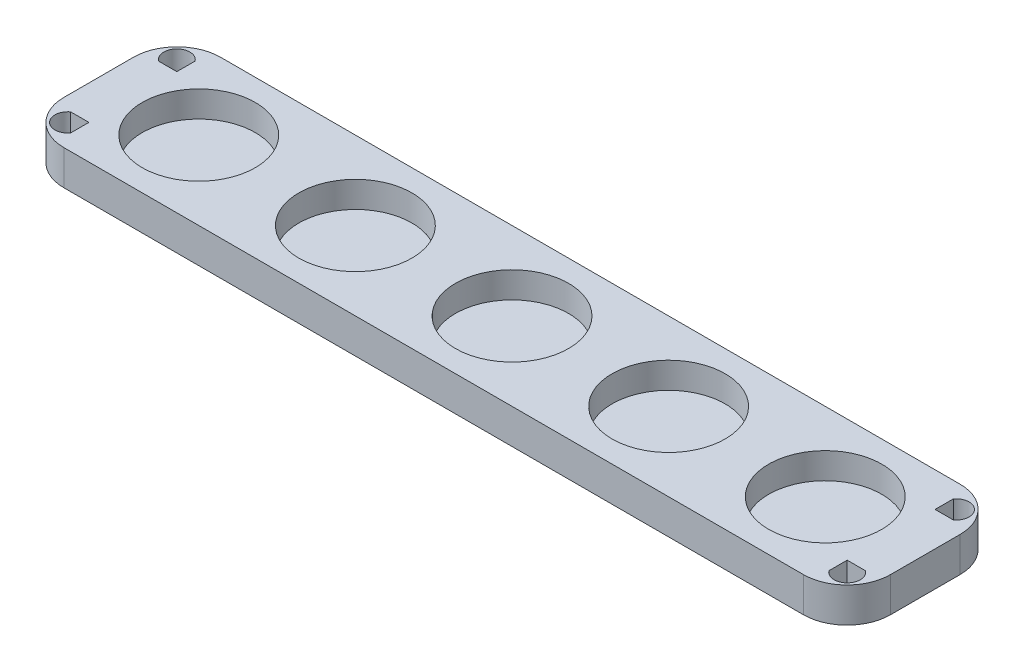
ISO-10303-21;
HEADER;
FILE_DESCRIPTION(('STEP AP214'),'2;1');
FILE_NAME('part.step','',(''),(''),'','','');
FILE_SCHEMA(('AUTOMOTIVE_DESIGN { 1 0 10303 214 1 1 1 1 }'));
ENDSEC;
DATA;
#1=APPLICATION_CONTEXT('core data for automotive mechanical design processes');
#2=APPLICATION_PROTOCOL_DEFINITION('international standard','automotive_design',2000,#1);
#3=PRODUCT_CONTEXT('',#1,'mechanical');
#4=PRODUCT('Part','Part','',(#3));
#5=PRODUCT_RELATED_PRODUCT_CATEGORY('part','',(#4));
#6=PRODUCT_DEFINITION_FORMATION('','',#4);
#7=PRODUCT_DEFINITION_CONTEXT('part definition',#1,'design');
#8=PRODUCT_DEFINITION('design','',#6,#7);
#9=PRODUCT_DEFINITION_SHAPE('','',#8);
#10=(LENGTH_UNIT() NAMED_UNIT(*) SI_UNIT(.MILLI.,.METRE.));
#11=(NAMED_UNIT(*) PLANE_ANGLE_UNIT() SI_UNIT($,.RADIAN.));
#12=(NAMED_UNIT(*) SI_UNIT($,.STERADIAN.) SOLID_ANGLE_UNIT());
#13=UNCERTAINTY_MEASURE_WITH_UNIT(LENGTH_MEASURE(1.E-05),#10,'distance_accuracy_value','');
#14=(GEOMETRIC_REPRESENTATION_CONTEXT(3) GLOBAL_UNCERTAINTY_ASSIGNED_CONTEXT((#13)) GLOBAL_UNIT_ASSIGNED_CONTEXT((#10,
#11,#12)) REPRESENTATION_CONTEXT('',''));
#15=CARTESIAN_POINT('',(0.,0.,0.));
#16=DIRECTION('',(0.,0.,1.));
#17=DIRECTION('',(1.,0.,0.));
#18=AXIS2_PLACEMENT_3D('',#15,#16,#17);
#19=CARTESIAN_POINT('',(0.,8.,0.));
#20=DIRECTION('',(0.,-1.,0.));
#21=DIRECTION('',(0.,0.,-1.));
#22=AXIS2_PLACEMENT_3D('',#19,#20,#21);
#23=PLANE('',#22);
#24=DIRECTION('',(-1.,0.,0.));
#25=VECTOR('',#24,1.);
#26=CARTESIAN_POINT('',(186.347435554875,8.,-28.100196168739));
#27=LINE('',#26,#25);
#28=CARTESIAN_POINT('',(186.347435554875,8.,-28.100196168739));
#29=VERTEX_POINT('',#28);
#30=CARTESIAN_POINT('',(182.147435554875,8.,-28.100196168739));
#31=VERTEX_POINT('',#30);
#32=EDGE_CURVE('E69',#29,#31,#27,.T.);
#33=ORIENTED_EDGE('',*,*,#32,.T.);
#34=DIRECTION('',(0.,0.,-1.));
#35=VECTOR('',#34,1.);
#36=CARTESIAN_POINT('',(182.147435554875,8.,-28.100196168739));
#37=LINE('',#36,#35);
#38=CARTESIAN_POINT('',(182.147435554875,8.,-32.300196168739));
#39=VERTEX_POINT('',#38);
#40=EDGE_CURVE('E269',#31,#39,#37,.T.);
#41=ORIENTED_EDGE('',*,*,#40,.T.);
#42=CARTESIAN_POINT('',(184.553451982046,8.,-30.5062125959102));
#43=DIRECTION('',(0.,-1.,0.));
#44=DIRECTION('',(0.,0.,-1.));
#45=AXIS2_PLACEMENT_3D('',#42,#43,#44);
#46=CIRCLE('',#45,3.00121510515279);
#47=EDGE_CURVE('E265',#39,#29,#46,.T.);
#48=ORIENTED_EDGE('',*,*,#47,.T.);
#49=EDGE_LOOP('',(#33,#41,#48));
#50=FACE_BOUND('',#49,.T.);
#51=CARTESIAN_POINT('',(184.553451982046,8.,-5.4937874040897));
#52=DIRECTION('',(0.,1.,0.));
#53=DIRECTION('',(0.,0.,1.));
#54=AXIS2_PLACEMENT_3D('',#51,#52,#53);
#55=CIRCLE('',#54,3.00121510515279);
#56=CARTESIAN_POINT('',(182.147435554875,8.,-3.69980383126088));
#57=VERTEX_POINT('',#56);
#58=CARTESIAN_POINT('',(186.347435554875,8.,-7.89980383126088));
#59=VERTEX_POINT('',#58);
#60=EDGE_CURVE('E207',#57,#59,#55,.T.);
#61=ORIENTED_EDGE('',*,*,#60,.F.);
#62=DIRECTION('',(0.,0.,1.));
#63=VECTOR('',#62,1.);
#64=CARTESIAN_POINT('',(182.147435554875,8.,-7.89980383126087));
#65=LINE('',#64,#63);
#66=CARTESIAN_POINT('',(182.147435554875,8.,-7.89980383126087));
#67=VERTEX_POINT('',#66);
#68=EDGE_CURVE('E190',#67,#57,#65,.T.);
#69=ORIENTED_EDGE('',*,*,#68,.F.);
#70=DIRECTION('',(-1.,0.,0.));
#71=VECTOR('',#70,1.);
#72=CARTESIAN_POINT('',(186.347435554875,8.,-7.89980383126086));
#73=LINE('',#72,#71);
#74=EDGE_CURVE('E200',#59,#67,#73,.T.);
#75=ORIENTED_EDGE('',*,*,#74,.F.);
#76=EDGE_LOOP('',(#61,#69,#75));
#77=FACE_BOUND('',#76,.T.);
#78=CARTESIAN_POINT('',(5.44654801795418,8.,-30.5062125959102));
#79=DIRECTION('',(0.,1.,0.));
#80=DIRECTION('',(0.,0.,1.));
#81=AXIS2_PLACEMENT_3D('',#78,#79,#80);
#82=CIRCLE('',#81,3.00121510515278);
#83=CARTESIAN_POINT('',(7.85256444512534,8.,-32.3001961687391));
#84=VERTEX_POINT('',#83);
#85=CARTESIAN_POINT('',(3.65256444512534,8.,-28.1001961687391));
#86=VERTEX_POINT('',#85);
#87=EDGE_CURVE('E300',#84,#86,#82,.T.);
#88=ORIENTED_EDGE('',*,*,#87,.F.);
#89=DIRECTION('',(0.,0.,-1.));
#90=VECTOR('',#89,1.);
#91=CARTESIAN_POINT('',(7.85256444512534,8.,-28.1001961687391));
#92=LINE('',#91,#90);
#93=CARTESIAN_POINT('',(7.85256444512534,8.,-28.1001961687391));
#94=VERTEX_POINT('',#93);
#95=EDGE_CURVE('E250',#94,#84,#92,.T.);
#96=ORIENTED_EDGE('',*,*,#95,.F.);
#97=DIRECTION('',(1.,0.,0.));
#98=VECTOR('',#97,1.);
#99=CARTESIAN_POINT('',(3.65256444512534,8.,-28.1001961687391));
#100=LINE('',#99,#98);
#101=EDGE_CURVE('E289',#86,#94,#100,.T.);
#102=ORIENTED_EDGE('',*,*,#101,.F.);
#103=EDGE_LOOP('',(#88,#96,#102));
#104=FACE_BOUND('',#103,.T.);
#105=CARTESIAN_POINT('',(23.,8.,-18.));
#106=DIRECTION('',(0.,1.,0.));
#107=DIRECTION('',(0.,0.,1.));
#108=AXIS2_PLACEMENT_3D('',#105,#106,#107);
#109=CIRCLE('',#108,13.);
#110=CARTESIAN_POINT('',(23.,8.,-4.99999999999999));
#111=VERTEX_POINT('',#110);
#112=EDGE_CURVE('E322',#111,#111,#109,.T.);
#113=ORIENTED_EDGE('',*,*,#112,.F.);
#114=EDGE_LOOP('',(#113));
#115=FACE_BOUND('',#114,.T.);
#116=CARTESIAN_POINT('',(59.,8.,-18.));
#117=DIRECTION('',(0.,1.,0.));
#118=DIRECTION('',(0.,0.,1.));
#119=AXIS2_PLACEMENT_3D('',#116,#117,#118);
#120=CIRCLE('',#119,13.);
#121=CARTESIAN_POINT('',(59.,8.,-4.99999999999998));
#122=VERTEX_POINT('',#121);
#123=EDGE_CURVE('E326',#122,#122,#120,.T.);
#124=ORIENTED_EDGE('',*,*,#123,.F.);
#125=EDGE_LOOP('',(#124));
#126=FACE_BOUND('',#125,.T.);
#127=CARTESIAN_POINT('',(95.0046201605951,8.,-18.));
#128=DIRECTION('',(0.,1.,0.));
#129=DIRECTION('',(0.,0.,1.));
#130=AXIS2_PLACEMENT_3D('',#127,#128,#129);
#131=CIRCLE('',#130,13.);
#132=CARTESIAN_POINT('',(95.0046201605951,8.,-5.));
#133=VERTEX_POINT('',#132);
#134=EDGE_CURVE('E334',#133,#133,#131,.T.);
#135=ORIENTED_EDGE('',*,*,#134,.F.);
#136=EDGE_LOOP('',(#135));
#137=FACE_BOUND('',#136,.T.);
#138=CARTESIAN_POINT('',(131.004620160595,8.,-18.));
#139=DIRECTION('',(0.,1.,0.));
#140=DIRECTION('',(0.,0.,1.));
#141=AXIS2_PLACEMENT_3D('',#138,#139,#140);
#142=CIRCLE('',#141,13.);
#143=CARTESIAN_POINT('',(131.004620160595,8.,-5.00000000000002));
#144=VERTEX_POINT('',#143);
#145=EDGE_CURVE('E342',#144,#144,#142,.T.);
#146=ORIENTED_EDGE('',*,*,#145,.F.);
#147=EDGE_LOOP('',(#146));
#148=FACE_BOUND('',#147,.T.);
#149=CARTESIAN_POINT('',(167.002310080298,8.,-18.));
#150=DIRECTION('',(0.,1.,0.));
#151=DIRECTION('',(0.,0.,1.));
#152=AXIS2_PLACEMENT_3D('',#149,#150,#151);
#153=CIRCLE('',#152,12.9976899197025);
#154=CARTESIAN_POINT('',(167.002310080298,8.,-5.00231008029754));
#155=VERTEX_POINT('',#154);
#156=EDGE_CURVE('E350',#155,#155,#153,.T.);
#157=ORIENTED_EDGE('',*,*,#156,.F.);
#158=EDGE_LOOP('',(#157));
#159=FACE_BOUND('',#158,.T.);
#160=DIRECTION('',(1.,0.,0.));
#161=VECTOR('',#160,1.);
#162=CARTESIAN_POINT('',(0.,8.,0.));
#163=LINE('',#162,#161);
#164=CARTESIAN_POINT('',(10.,8.,0.));
#165=VERTEX_POINT('',#164);
#166=CARTESIAN_POINT('',(180.,8.,0.));
#167=VERTEX_POINT('',#166);
#168=EDGE_CURVE('E361',#165,#167,#163,.T.);
#169=ORIENTED_EDGE('',*,*,#168,.T.);
#170=CARTESIAN_POINT('',(180.,8.,-10.));
#171=DIRECTION('',(0.,-1.,0.));
#172=DIRECTION('',(0.,0.,-1.));
#173=AXIS2_PLACEMENT_3D('',#170,#171,#172);
#174=CIRCLE('',#173,10.);
#175=CARTESIAN_POINT('',(190.,8.,-10.));
#176=VERTEX_POINT('',#175);
#177=EDGE_CURVE('E423',#167,#176,#174,.F.);
#178=ORIENTED_EDGE('',*,*,#177,.T.);
#179=DIRECTION('',(0.,0.,-1.));
#180=VECTOR('',#179,1.);
#181=CARTESIAN_POINT('',(190.,8.,0.));
#182=LINE('',#181,#180);
#183=CARTESIAN_POINT('',(190.,8.,-26.));
#184=VERTEX_POINT('',#183);
#185=EDGE_CURVE('E366',#176,#184,#182,.T.);
#186=ORIENTED_EDGE('',*,*,#185,.T.);
#187=CARTESIAN_POINT('',(180.,8.,-26.));
#188=DIRECTION('',(0.,-1.,0.));
#189=DIRECTION('',(0.,0.,-1.));
#190=AXIS2_PLACEMENT_3D('',#187,#188,#189);
#191=CIRCLE('',#190,10.);
#192=CARTESIAN_POINT('',(180.,8.,-36.));
#193=VERTEX_POINT('',#192);
#194=EDGE_CURVE('E420',#184,#193,#191,.F.);
#195=ORIENTED_EDGE('',*,*,#194,.T.);
#196=DIRECTION('',(-1.,0.,0.));
#197=VECTOR('',#196,1.);
#198=CARTESIAN_POINT('',(0.,8.,-36.));
#199=LINE('',#198,#197);
#200=CARTESIAN_POINT('',(10.,8.,-36.));
#201=VERTEX_POINT('',#200);
#202=EDGE_CURVE('E370',#193,#201,#199,.T.);
#203=ORIENTED_EDGE('',*,*,#202,.T.);
#204=CARTESIAN_POINT('',(10.,8.,-26.));
#205=DIRECTION('',(0.,-1.,0.));
#206=DIRECTION('',(0.,0.,-1.));
#207=AXIS2_PLACEMENT_3D('',#204,#205,#206);
#208=CIRCLE('',#207,10.);
#209=CARTESIAN_POINT('',(0.,8.,-26.));
#210=VERTEX_POINT('',#209);
#211=EDGE_CURVE('E417',#201,#210,#208,.F.);
#212=ORIENTED_EDGE('',*,*,#211,.T.);
#213=DIRECTION('',(0.,0.,1.));
#214=VECTOR('',#213,1.);
#215=CARTESIAN_POINT('',(0.,8.,0.));
#216=LINE('',#215,#214);
#217=CARTESIAN_POINT('',(0.,8.,-10.));
#218=VERTEX_POINT('',#217);
#219=EDGE_CURVE('E357',#210,#218,#216,.T.);
#220=ORIENTED_EDGE('',*,*,#219,.T.);
#221=CARTESIAN_POINT('',(10.,8.,-10.));
#222=DIRECTION('',(0.,-1.,0.));
#223=DIRECTION('',(0.,0.,-1.));
#224=AXIS2_PLACEMENT_3D('',#221,#222,#223);
#225=CIRCLE('',#224,10.);
#226=EDGE_CURVE('E414',#218,#165,#225,.F.);
#227=ORIENTED_EDGE('',*,*,#226,.T.);
#228=EDGE_LOOP('',(#169,#178,#186,#195,#203,#212,#220,#227));
#229=FACE_BOUND('',#228,.T.);
#230=CARTESIAN_POINT('',(5.44654801795418,8.,-5.49378740408977));
#231=DIRECTION('',(0.,-1.,0.));
#232=DIRECTION('',(0.,0.,-1.));
#233=AXIS2_PLACEMENT_3D('',#230,#231,#232);
#234=CIRCLE('',#233,3.00121510515278);
#235=CARTESIAN_POINT('',(7.85256444512534,8.,-3.69980383126093));
#236=VERTEX_POINT('',#235);
#237=CARTESIAN_POINT('',(3.65256444512534,8.,-7.89980383126093));
#238=VERTEX_POINT('',#237);
#239=EDGE_CURVE('E61',#236,#238,#234,.T.);
#240=ORIENTED_EDGE('',*,*,#239,.T.);
#241=DIRECTION('',(1.,0.,0.));
#242=VECTOR('',#241,1.);
#243=CARTESIAN_POINT('',(3.65256444512534,8.,-7.89980383126093));
#244=LINE('',#243,#242);
#245=CARTESIAN_POINT('',(7.85256444512534,8.,-7.89980383126094));
#246=VERTEX_POINT('',#245);
#247=EDGE_CURVE('E243',#238,#246,#244,.T.);
#248=ORIENTED_EDGE('',*,*,#247,.T.);
#249=DIRECTION('',(0.,0.,1.));
#250=VECTOR('',#249,1.);
#251=CARTESIAN_POINT('',(7.85256444512534,8.,-7.89980383126094));
#252=LINE('',#251,#250);
#253=EDGE_CURVE('E239',#246,#236,#252,.T.);
#254=ORIENTED_EDGE('',*,*,#253,.T.);
#255=EDGE_LOOP('',(#240,#248,#254));
#256=FACE_BOUND('',#255,.T.);
#257=ADVANCED_FACE('F45',(#50,#77,#104,#115,#126,#137,#148,#159,#229,#256),#23,.F.);
#258=CARTESIAN_POINT('',(0.,0.,0.));
#259=DIRECTION('',(0.,-1.,0.));
#260=DIRECTION('',(0.,0.,-1.));
#261=AXIS2_PLACEMENT_3D('',#258,#259,#260);
#262=PLANE('',#261);
#263=DIRECTION('',(0.,0.,1.));
#264=VECTOR('',#263,1.);
#265=CARTESIAN_POINT('',(182.147435554875,0.,-7.89980383126087));
#266=LINE('',#265,#264);
#267=CARTESIAN_POINT('',(182.147435554875,0.,-7.89980383126087));
#268=VERTEX_POINT('',#267);
#269=CARTESIAN_POINT('',(182.147435554875,0.,-3.69980383126087));
#270=VERTEX_POINT('',#269);
#271=EDGE_CURVE('E193',#268,#270,#266,.T.);
#272=ORIENTED_EDGE('',*,*,#271,.T.);
#273=CARTESIAN_POINT('',(184.553451982046,0.,-5.4937874040897));
#274=DIRECTION('',(0.,1.,0.));
#275=DIRECTION('',(0.,0.,1.));
#276=AXIS2_PLACEMENT_3D('',#273,#274,#275);
#277=CIRCLE('',#276,3.00121510515279);
#278=CARTESIAN_POINT('',(186.347435554875,0.,-7.89980383126088));
#279=VERTEX_POINT('',#278);
#280=EDGE_CURVE('E222',#270,#279,#277,.T.);
#281=ORIENTED_EDGE('',*,*,#280,.T.);
#282=DIRECTION('',(-1.,0.,0.));
#283=VECTOR('',#282,1.);
#284=CARTESIAN_POINT('',(186.347435554875,0.,-7.89980383126086));
#285=LINE('',#284,#283);
#286=EDGE_CURVE('E219',#279,#268,#285,.T.);
#287=ORIENTED_EDGE('',*,*,#286,.T.);
#288=EDGE_LOOP('',(#272,#281,#287));
#289=FACE_BOUND('',#288,.T.);
#290=DIRECTION('',(0.,0.,-1.));
#291=VECTOR('',#290,1.);
#292=CARTESIAN_POINT('',(7.85256444512534,0.,-28.1001961687391));
#293=LINE('',#292,#291);
#294=CARTESIAN_POINT('',(7.85256444512534,0.,-28.1001961687391));
#295=VERTEX_POINT('',#294);
#296=CARTESIAN_POINT('',(7.85256444512534,0.,-32.3001961687391));
#297=VERTEX_POINT('',#296);
#298=EDGE_CURVE('E284',#295,#297,#293,.T.);
#299=ORIENTED_EDGE('',*,*,#298,.T.);
#300=CARTESIAN_POINT('',(5.44654801795418,0.,-30.5062125959102));
#301=DIRECTION('',(0.,1.,0.));
#302=DIRECTION('',(0.,0.,1.));
#303=AXIS2_PLACEMENT_3D('',#300,#301,#302);
#304=CIRCLE('',#303,3.00121510515278);
#305=CARTESIAN_POINT('',(3.65256444512534,0.,-28.1001961687391));
#306=VERTEX_POINT('',#305);
#307=EDGE_CURVE('E288',#297,#306,#304,.T.);
#308=ORIENTED_EDGE('',*,*,#307,.T.);
#309=DIRECTION('',(1.,0.,0.));
#310=VECTOR('',#309,1.);
#311=CARTESIAN_POINT('',(3.65256444512534,0.,-28.1001961687391));
#312=LINE('',#311,#310);
#313=EDGE_CURVE('E293',#306,#295,#312,.T.);
#314=ORIENTED_EDGE('',*,*,#313,.T.);
#315=EDGE_LOOP('',(#299,#308,#314));
#316=FACE_BOUND('',#315,.T.);
#317=DIRECTION('',(0.,0.,-1.));
#318=VECTOR('',#317,1.);
#319=CARTESIAN_POINT('',(190.,0.,0.));
#320=LINE('',#319,#318);
#321=CARTESIAN_POINT('',(190.,0.,-10.));
#322=VERTEX_POINT('',#321);
#323=CARTESIAN_POINT('',(190.,0.,-26.));
#324=VERTEX_POINT('',#323);
#325=EDGE_CURVE('E382',#322,#324,#320,.T.);
#326=ORIENTED_EDGE('',*,*,#325,.F.);
#327=CARTESIAN_POINT('',(180.,0.,-10.));
#328=DIRECTION('',(0.,-1.,0.));
#329=DIRECTION('',(0.,0.,-1.));
#330=AXIS2_PLACEMENT_3D('',#327,#328,#329);
#331=CIRCLE('',#330,10.);
#332=CARTESIAN_POINT('',(180.,0.,0.));
#333=VERTEX_POINT('',#332);
#334=EDGE_CURVE('E404',#322,#333,#331,.T.);
#335=ORIENTED_EDGE('',*,*,#334,.T.);
#336=DIRECTION('',(1.,0.,0.));
#337=VECTOR('',#336,1.);
#338=CARTESIAN_POINT('',(0.,0.,0.));
#339=LINE('',#338,#337);
#340=CARTESIAN_POINT('',(10.,0.,0.));
#341=VERTEX_POINT('',#340);
#342=EDGE_CURVE('E378',#341,#333,#339,.T.);
#343=ORIENTED_EDGE('',*,*,#342,.F.);
#344=CARTESIAN_POINT('',(10.,0.,-10.));
#345=DIRECTION('',(0.,-1.,0.));
#346=DIRECTION('',(0.,0.,-1.));
#347=AXIS2_PLACEMENT_3D('',#344,#345,#346);
#348=CIRCLE('',#347,10.);
#349=CARTESIAN_POINT('',(0.,0.,-10.));
#350=VERTEX_POINT('',#349);
#351=EDGE_CURVE('E395',#341,#350,#348,.T.);
#352=ORIENTED_EDGE('',*,*,#351,.T.);
#353=DIRECTION('',(0.,0.,1.));
#354=VECTOR('',#353,1.);
#355=CARTESIAN_POINT('',(0.,0.,0.));
#356=LINE('',#355,#354);
#357=CARTESIAN_POINT('',(0.,0.,-26.));
#358=VERTEX_POINT('',#357);
#359=EDGE_CURVE('E321',#358,#350,#356,.T.);
#360=ORIENTED_EDGE('',*,*,#359,.F.);
#361=CARTESIAN_POINT('',(10.,0.,-26.));
#362=DIRECTION('',(0.,-1.,0.));
#363=DIRECTION('',(0.,0.,-1.));
#364=AXIS2_PLACEMENT_3D('',#361,#362,#363);
#365=CIRCLE('',#364,10.);
#366=CARTESIAN_POINT('',(10.,0.,-36.));
#367=VERTEX_POINT('',#366);
#368=EDGE_CURVE('E398',#358,#367,#365,.T.);
#369=ORIENTED_EDGE('',*,*,#368,.T.);
#370=DIRECTION('',(-1.,0.,0.));
#371=VECTOR('',#370,1.);
#372=CARTESIAN_POINT('',(0.,0.,-36.));
#373=LINE('',#372,#371);
#374=CARTESIAN_POINT('',(180.,0.,-36.));
#375=VERTEX_POINT('',#374);
#376=EDGE_CURVE('E362',#375,#367,#373,.T.);
#377=ORIENTED_EDGE('',*,*,#376,.F.);
#378=CARTESIAN_POINT('',(180.,0.,-26.));
#379=DIRECTION('',(0.,-1.,0.));
#380=DIRECTION('',(0.,0.,-1.));
#381=AXIS2_PLACEMENT_3D('',#378,#379,#380);
#382=CIRCLE('',#381,10.);
#383=EDGE_CURVE('E401',#375,#324,#382,.T.);
#384=ORIENTED_EDGE('',*,*,#383,.T.);
#385=EDGE_LOOP('',(#326,#335,#343,#352,#360,#369,#377,#384));
#386=FACE_BOUND('',#385,.T.);
#387=DIRECTION('',(0.,0.,-1.));
#388=VECTOR('',#387,1.);
#389=CARTESIAN_POINT('',(182.147435554875,0.,-28.100196168739));
#390=LINE('',#389,#388);
#391=CARTESIAN_POINT('',(182.147435554875,0.,-28.100196168739));
#392=VERTEX_POINT('',#391);
#393=CARTESIAN_POINT('',(182.147435554875,0.,-32.300196168739));
#394=VERTEX_POINT('',#393);
#395=EDGE_CURVE('E278',#392,#394,#390,.T.);
#396=ORIENTED_EDGE('',*,*,#395,.F.);
#397=DIRECTION('',(-1.,0.,0.));
#398=VECTOR('',#397,1.);
#399=CARTESIAN_POINT('',(186.347435554875,0.,-28.100196168739));
#400=LINE('',#399,#398);
#401=CARTESIAN_POINT('',(186.347435554875,0.,-28.100196168739));
#402=VERTEX_POINT('',#401);
#403=EDGE_CURVE('E270',#402,#392,#400,.T.);
#404=ORIENTED_EDGE('',*,*,#403,.F.);
#405=CARTESIAN_POINT('',(184.553451982046,0.,-30.5062125959102));
#406=DIRECTION('',(0.,-1.,0.));
#407=DIRECTION('',(0.,0.,-1.));
#408=AXIS2_PLACEMENT_3D('',#405,#406,#407);
#409=CIRCLE('',#408,3.00121510515279);
#410=EDGE_CURVE('E264',#394,#402,#409,.T.);
#411=ORIENTED_EDGE('',*,*,#410,.F.);
#412=EDGE_LOOP('',(#396,#404,#411));
#413=FACE_BOUND('',#412,.T.);
#414=DIRECTION('',(1.,0.,0.));
#415=VECTOR('',#414,1.);
#416=CARTESIAN_POINT('',(3.65256444512534,0.,-7.89980383126093));
#417=LINE('',#416,#415);
#418=CARTESIAN_POINT('',(3.65256444512534,0.,-7.89980383126093));
#419=VERTEX_POINT('',#418);
#420=CARTESIAN_POINT('',(7.85256444512534,0.,-7.89980383126094));
#421=VERTEX_POINT('',#420);
#422=EDGE_CURVE('E253',#419,#421,#417,.T.);
#423=ORIENTED_EDGE('',*,*,#422,.F.);
#424=CARTESIAN_POINT('',(5.44654801795418,0.,-5.49378740408977));
#425=DIRECTION('',(0.,-1.,0.));
#426=DIRECTION('',(0.,0.,-1.));
#427=AXIS2_PLACEMENT_3D('',#424,#425,#426);
#428=CIRCLE('',#427,3.00121510515278);
#429=CARTESIAN_POINT('',(7.85256444512534,0.,-3.69980383126093));
#430=VERTEX_POINT('',#429);
#431=EDGE_CURVE('E244',#430,#419,#428,.T.);
#432=ORIENTED_EDGE('',*,*,#431,.F.);
#433=DIRECTION('',(0.,0.,1.));
#434=VECTOR('',#433,1.);
#435=CARTESIAN_POINT('',(7.85256444512534,0.,-7.89980383126094));
#436=LINE('',#435,#434);
#437=EDGE_CURVE('E238',#421,#430,#436,.T.);
#438=ORIENTED_EDGE('',*,*,#437,.F.);
#439=EDGE_LOOP('',(#423,#432,#438));
#440=FACE_BOUND('',#439,.T.);
#441=ADVANCED_FACE('F452',(#289,#316,#386,#413,#440),#262,.T.);
#442=CARTESIAN_POINT('',(0.,8.,0.));
#443=DIRECTION('',(1.,0.,0.));
#444=DIRECTION('',(0.,0.,-1.));
#445=AXIS2_PLACEMENT_3D('',#442,#443,#444);
#446=PLANE('',#445);
#447=ORIENTED_EDGE('',*,*,#219,.F.);
#448=DIRECTION('',(0.,-1.,0.));
#449=VECTOR('',#448,1.);
#450=CARTESIAN_POINT('',(0.,8.,-26.));
#451=LINE('',#450,#449);
#452=EDGE_CURVE('E11',#210,#358,#451,.T.);
#453=ORIENTED_EDGE('',*,*,#452,.T.);
#454=ORIENTED_EDGE('',*,*,#359,.T.);
#455=DIRECTION('',(0.,-1.,0.));
#456=VECTOR('',#455,1.);
#457=CARTESIAN_POINT('',(0.,8.,-10.));
#458=LINE('',#457,#456);
#459=EDGE_CURVE('E54',#350,#218,#458,.F.);
#460=ORIENTED_EDGE('',*,*,#459,.T.);
#461=EDGE_LOOP('',(#447,#453,#454,#460));
#462=FACE_BOUND('',#461,.T.);
#463=ADVANCED_FACE('F436',(#462),#446,.F.);
#464=CARTESIAN_POINT('',(0.,8.,0.));
#465=DIRECTION('',(0.,0.,-1.));
#466=DIRECTION('',(-1.,0.,0.));
#467=AXIS2_PLACEMENT_3D('',#464,#465,#466);
#468=PLANE('',#467);
#469=ORIENTED_EDGE('',*,*,#342,.T.);
#470=DIRECTION('',(0.,-1.,0.));
#471=VECTOR('',#470,1.);
#472=CARTESIAN_POINT('',(180.,8.,0.));
#473=LINE('',#472,#471);
#474=EDGE_CURVE('E411',#333,#167,#473,.F.);
#475=ORIENTED_EDGE('',*,*,#474,.T.);
#476=ORIENTED_EDGE('',*,*,#168,.F.);
#477=DIRECTION('',(0.,-1.,0.));
#478=VECTOR('',#477,1.);
#479=CARTESIAN_POINT('',(10.,8.,0.));
#480=LINE('',#479,#478);
#481=EDGE_CURVE('E407',#165,#341,#480,.T.);
#482=ORIENTED_EDGE('',*,*,#481,.T.);
#483=EDGE_LOOP('',(#469,#475,#476,#482));
#484=FACE_BOUND('',#483,.T.);
#485=ADVANCED_FACE('F448',(#484),#468,.F.);
#486=CARTESIAN_POINT('',(190.,8.,0.));
#487=DIRECTION('',(-1.,0.,0.));
#488=DIRECTION('',(0.,0.,1.));
#489=AXIS2_PLACEMENT_3D('',#486,#487,#488);
#490=PLANE('',#489);
#491=ORIENTED_EDGE('',*,*,#185,.F.);
#492=DIRECTION('',(0.,-1.,0.));
#493=VECTOR('',#492,1.);
#494=CARTESIAN_POINT('',(190.,8.,-10.));
#495=LINE('',#494,#493);
#496=EDGE_CURVE('E391',#176,#322,#495,.T.);
#497=ORIENTED_EDGE('',*,*,#496,.T.);
#498=ORIENTED_EDGE('',*,*,#325,.T.);
#499=DIRECTION('',(0.,-1.,0.));
#500=VECTOR('',#499,1.);
#501=CARTESIAN_POINT('',(190.,8.,-26.));
#502=LINE('',#501,#500);
#503=EDGE_CURVE('E374',#324,#184,#502,.F.);
#504=ORIENTED_EDGE('',*,*,#503,.T.);
#505=EDGE_LOOP('',(#491,#497,#498,#504));
#506=FACE_BOUND('',#505,.T.);
#507=ADVANCED_FACE('F460',(#506),#490,.F.);
#508=CARTESIAN_POINT('',(0.,8.,-36.));
#509=DIRECTION('',(0.,0.,1.));
#510=DIRECTION('',(1.,0.,0.));
#511=AXIS2_PLACEMENT_3D('',#508,#509,#510);
#512=PLANE('',#511);
#513=ORIENTED_EDGE('',*,*,#202,.F.);
#514=DIRECTION('',(0.,-1.,0.));
#515=VECTOR('',#514,1.);
#516=CARTESIAN_POINT('',(180.,8.,-36.));
#517=LINE('',#516,#515);
#518=EDGE_CURVE('E429',#193,#375,#517,.T.);
#519=ORIENTED_EDGE('',*,*,#518,.T.);
#520=ORIENTED_EDGE('',*,*,#376,.T.);
#521=DIRECTION('',(0.,-1.,0.));
#522=VECTOR('',#521,1.);
#523=CARTESIAN_POINT('',(10.,8.,-36.));
#524=LINE('',#523,#522);
#525=EDGE_CURVE('E426',#367,#201,#524,.F.);
#526=ORIENTED_EDGE('',*,*,#525,.T.);
#527=EDGE_LOOP('',(#513,#519,#520,#526));
#528=FACE_BOUND('',#527,.T.);
#529=ADVANCED_FACE('F469',(#528),#512,.F.);
#530=CARTESIAN_POINT('',(167.002310080298,2.,-18.));
#531=DIRECTION('',(0.,1.,0.));
#532=DIRECTION('',(0.,0.,1.));
#533=AXIS2_PLACEMENT_3D('',#530,#531,#532);
#534=CYLINDRICAL_SURFACE('',#533,12.9976899197025);
#535=CARTESIAN_POINT('',(167.002310080298,2.,-18.));
#536=DIRECTION('',(0.,1.,0.));
#537=DIRECTION('',(0.,0.,1.));
#538=AXIS2_PLACEMENT_3D('',#535,#536,#537);
#539=CIRCLE('',#538,12.9976899197025);
#540=CARTESIAN_POINT('',(167.002310080298,2.,-5.00231008029754));
#541=VERTEX_POINT('',#540);
#542=EDGE_CURVE('E310',#541,#541,#539,.T.);
#543=ORIENTED_EDGE('',*,*,#542,.F.);
#544=EDGE_LOOP('',(#543));
#545=FACE_BOUND('',#544,.T.);
#546=ORIENTED_EDGE('',*,*,#156,.T.);
#547=EDGE_LOOP('',(#546));
#548=FACE_BOUND('',#547,.T.);
#549=ADVANCED_FACE('F494',(#545,#548),#534,.F.);
#550=CARTESIAN_POINT('',(167.002310080298,2.,-18.));
#551=DIRECTION('',(0.,1.,0.));
#552=DIRECTION('',(0.,0.,1.));
#553=AXIS2_PLACEMENT_3D('',#550,#551,#552);
#554=PLANE('',#553);
#555=ORIENTED_EDGE('',*,*,#542,.T.);
#556=EDGE_LOOP('',(#555));
#557=FACE_BOUND('',#556,.T.);
#558=ADVANCED_FACE('F489',(#557),#554,.T.);
#559=CARTESIAN_POINT('',(131.004620160595,2.,-18.));
#560=DIRECTION('',(0.,1.,0.));
#561=DIRECTION('',(0.,0.,1.));
#562=AXIS2_PLACEMENT_3D('',#559,#560,#561);
#563=CYLINDRICAL_SURFACE('',#562,13.);
#564=CARTESIAN_POINT('',(131.004620160595,2.,-18.));
#565=DIRECTION('',(0.,1.,0.));
#566=DIRECTION('',(0.,0.,1.));
#567=AXIS2_PLACEMENT_3D('',#564,#565,#566);
#568=CIRCLE('',#567,13.);
#569=CARTESIAN_POINT('',(131.004620160595,2.,-5.00000000000002));
#570=VERTEX_POINT('',#569);
#571=EDGE_CURVE('E346',#570,#570,#568,.T.);
#572=ORIENTED_EDGE('',*,*,#571,.F.);
#573=EDGE_LOOP('',(#572));
#574=FACE_BOUND('',#573,.T.);
#575=ORIENTED_EDGE('',*,*,#145,.T.);
#576=EDGE_LOOP('',(#575));
#577=FACE_BOUND('',#576,.T.);
#578=ADVANCED_FACE('F534',(#574,#577),#563,.F.);
#579=CARTESIAN_POINT('',(131.004620160595,2.,-18.));
#580=DIRECTION('',(0.,1.,0.));
#581=DIRECTION('',(0.,0.,1.));
#582=AXIS2_PLACEMENT_3D('',#579,#580,#581);
#583=PLANE('',#582);
#584=ORIENTED_EDGE('',*,*,#571,.T.);
#585=EDGE_LOOP('',(#584));
#586=FACE_BOUND('',#585,.T.);
#587=ADVANCED_FACE('F529',(#586),#583,.T.);
#588=CARTESIAN_POINT('',(95.0046201605951,2.,-18.));
#589=DIRECTION('',(0.,1.,0.));
#590=DIRECTION('',(0.,0.,1.));
#591=AXIS2_PLACEMENT_3D('',#588,#589,#590);
#592=CYLINDRICAL_SURFACE('',#591,13.);
#593=CARTESIAN_POINT('',(95.0046201605951,2.,-18.));
#594=DIRECTION('',(0.,1.,0.));
#595=DIRECTION('',(0.,0.,1.));
#596=AXIS2_PLACEMENT_3D('',#593,#594,#595);
#597=CIRCLE('',#596,13.);
#598=CARTESIAN_POINT('',(95.0046201605951,2.,-5.));
#599=VERTEX_POINT('',#598);
#600=EDGE_CURVE('E338',#599,#599,#597,.T.);
#601=ORIENTED_EDGE('',*,*,#600,.F.);
#602=EDGE_LOOP('',(#601));
#603=FACE_BOUND('',#602,.T.);
#604=ORIENTED_EDGE('',*,*,#134,.T.);
#605=EDGE_LOOP('',(#604));
#606=FACE_BOUND('',#605,.T.);
#607=ADVANCED_FACE('F526',(#603,#606),#592,.F.);
#608=CARTESIAN_POINT('',(95.0046201605951,2.,-18.));
#609=DIRECTION('',(0.,1.,0.));
#610=DIRECTION('',(0.,0.,1.));
#611=AXIS2_PLACEMENT_3D('',#608,#609,#610);
#612=PLANE('',#611);
#613=ORIENTED_EDGE('',*,*,#600,.T.);
#614=EDGE_LOOP('',(#613));
#615=FACE_BOUND('',#614,.T.);
#616=ADVANCED_FACE('F521',(#615),#612,.T.);
#617=CARTESIAN_POINT('',(59.,2.,-18.));
#618=DIRECTION('',(0.,1.,0.));
#619=DIRECTION('',(0.,0.,1.));
#620=AXIS2_PLACEMENT_3D('',#617,#618,#619);
#621=CYLINDRICAL_SURFACE('',#620,13.);
#622=CARTESIAN_POINT('',(59.,2.,-18.));
#623=DIRECTION('',(0.,1.,0.));
#624=DIRECTION('',(0.,0.,1.));
#625=AXIS2_PLACEMENT_3D('',#622,#623,#624);
#626=CIRCLE('',#625,13.);
#627=CARTESIAN_POINT('',(59.,2.,-4.99999999999998));
#628=VERTEX_POINT('',#627);
#629=EDGE_CURVE('E330',#628,#628,#626,.T.);
#630=ORIENTED_EDGE('',*,*,#629,.F.);
#631=EDGE_LOOP('',(#630));
#632=FACE_BOUND('',#631,.T.);
#633=ORIENTED_EDGE('',*,*,#123,.T.);
#634=EDGE_LOOP('',(#633));
#635=FACE_BOUND('',#634,.T.);
#636=ADVANCED_FACE('F518',(#632,#635),#621,.F.);
#637=CARTESIAN_POINT('',(59.,2.,-18.));
#638=DIRECTION('',(0.,1.,0.));
#639=DIRECTION('',(0.,0.,1.));
#640=AXIS2_PLACEMENT_3D('',#637,#638,#639);
#641=PLANE('',#640);
#642=ORIENTED_EDGE('',*,*,#629,.T.);
#643=EDGE_LOOP('',(#642));
#644=FACE_BOUND('',#643,.T.);
#645=ADVANCED_FACE('F512',(#644),#641,.T.);
#646=CARTESIAN_POINT('',(23.,2.,-18.));
#647=DIRECTION('',(0.,1.,0.));
#648=DIRECTION('',(0.,0.,1.));
#649=AXIS2_PLACEMENT_3D('',#646,#647,#648);
#650=CYLINDRICAL_SURFACE('',#649,13.);
#651=CARTESIAN_POINT('',(23.,2.,-18.));
#652=DIRECTION('',(0.,1.,0.));
#653=DIRECTION('',(0.,0.,1.));
#654=AXIS2_PLACEMENT_3D('',#651,#652,#653);
#655=CIRCLE('',#654,13.);
#656=CARTESIAN_POINT('',(23.,2.,-4.99999999999999));
#657=VERTEX_POINT('',#656);
#658=EDGE_CURVE('E317',#657,#657,#655,.T.);
#659=ORIENTED_EDGE('',*,*,#658,.F.);
#660=EDGE_LOOP('',(#659));
#661=FACE_BOUND('',#660,.T.);
#662=ORIENTED_EDGE('',*,*,#112,.T.);
#663=EDGE_LOOP('',(#662));
#664=FACE_BOUND('',#663,.T.);
#665=ADVANCED_FACE('F506',(#661,#664),#650,.F.);
#666=CARTESIAN_POINT('',(23.,2.,-18.));
#667=DIRECTION('',(0.,1.,0.));
#668=DIRECTION('',(0.,0.,1.));
#669=AXIS2_PLACEMENT_3D('',#666,#667,#668);
#670=PLANE('',#669);
#671=ORIENTED_EDGE('',*,*,#658,.T.);
#672=EDGE_LOOP('',(#671));
#673=FACE_BOUND('',#672,.T.);
#674=ADVANCED_FACE('F502',(#673),#670,.T.);
#675=CARTESIAN_POINT('',(180.,8.,-10.));
#676=DIRECTION('',(0.,-1.,0.));
#677=DIRECTION('',(0.,0.,-1.));
#678=AXIS2_PLACEMENT_3D('',#675,#676,#677);
#679=CYLINDRICAL_SURFACE('',#678,10.);
#680=ORIENTED_EDGE('',*,*,#177,.F.);
#681=ORIENTED_EDGE('',*,*,#474,.F.);
#682=ORIENTED_EDGE('',*,*,#334,.F.);
#683=ORIENTED_EDGE('',*,*,#496,.F.);
#684=EDGE_LOOP('',(#680,#681,#682,#683));
#685=FACE_BOUND('',#684,.T.);
#686=ADVANCED_FACE('F457',(#685),#679,.T.);
#687=CARTESIAN_POINT('',(180.,8.,-26.));
#688=DIRECTION('',(0.,-1.,0.));
#689=DIRECTION('',(0.,0.,-1.));
#690=AXIS2_PLACEMENT_3D('',#687,#688,#689);
#691=CYLINDRICAL_SURFACE('',#690,10.);
#692=ORIENTED_EDGE('',*,*,#194,.F.);
#693=ORIENTED_EDGE('',*,*,#503,.F.);
#694=ORIENTED_EDGE('',*,*,#383,.F.);
#695=ORIENTED_EDGE('',*,*,#518,.F.);
#696=EDGE_LOOP('',(#692,#693,#694,#695));
#697=FACE_BOUND('',#696,.T.);
#698=ADVANCED_FACE('F466',(#697),#691,.T.);
#699=CARTESIAN_POINT('',(10.,8.,-26.));
#700=DIRECTION('',(0.,-1.,0.));
#701=DIRECTION('',(0.,0.,-1.));
#702=AXIS2_PLACEMENT_3D('',#699,#700,#701);
#703=CYLINDRICAL_SURFACE('',#702,10.);
#704=ORIENTED_EDGE('',*,*,#211,.F.);
#705=ORIENTED_EDGE('',*,*,#525,.F.);
#706=ORIENTED_EDGE('',*,*,#368,.F.);
#707=ORIENTED_EDGE('',*,*,#452,.F.);
#708=EDGE_LOOP('',(#704,#705,#706,#707));
#709=FACE_BOUND('',#708,.T.);
#710=ADVANCED_FACE('F472',(#709),#703,.T.);
#711=CARTESIAN_POINT('',(10.,8.,-10.));
#712=DIRECTION('',(0.,-1.,0.));
#713=DIRECTION('',(0.,0.,-1.));
#714=AXIS2_PLACEMENT_3D('',#711,#712,#713);
#715=CYLINDRICAL_SURFACE('',#714,10.);
#716=ORIENTED_EDGE('',*,*,#226,.F.);
#717=ORIENTED_EDGE('',*,*,#459,.F.);
#718=ORIENTED_EDGE('',*,*,#351,.F.);
#719=ORIENTED_EDGE('',*,*,#481,.F.);
#720=EDGE_LOOP('',(#716,#717,#718,#719));
#721=FACE_BOUND('',#720,.T.);
#722=ADVANCED_FACE('F47',(#721),#715,.T.);
#723=CARTESIAN_POINT('',(7.85256444512534,0.,-28.1001961687391));
#724=DIRECTION('',(1.,0.,0.));
#725=DIRECTION('',(0.,0.,-1.));
#726=AXIS2_PLACEMENT_3D('',#723,#724,#725);
#727=PLANE('',#726);
#728=ORIENTED_EDGE('',*,*,#95,.T.);
#729=DIRECTION('',(0.,1.,0.));
#730=VECTOR('',#729,1.);
#731=CARTESIAN_POINT('',(7.85256444512534,0.,-32.3001961687391));
#732=LINE('',#731,#730);
#733=EDGE_CURVE('E297',#297,#84,#732,.T.);
#734=ORIENTED_EDGE('',*,*,#733,.F.);
#735=ORIENTED_EDGE('',*,*,#298,.F.);
#736=DIRECTION('',(0.,1.,0.));
#737=VECTOR('',#736,1.);
#738=CARTESIAN_POINT('',(7.85256444512534,0.,-28.1001961687391));
#739=LINE('',#738,#737);
#740=EDGE_CURVE('E307',#295,#94,#739,.T.);
#741=ORIENTED_EDGE('',*,*,#740,.T.);
#742=EDGE_LOOP('',(#728,#734,#735,#741));
#743=FACE_BOUND('',#742,.T.);
#744=ADVANCED_FACE('F478',(#743),#727,.F.);
#745=CARTESIAN_POINT('',(3.65256444512534,0.,-28.1001961687391));
#746=DIRECTION('',(0.,0.,1.));
#747=DIRECTION('',(1.,0.,0.));
#748=AXIS2_PLACEMENT_3D('',#745,#746,#747);
#749=PLANE('',#748);
#750=ORIENTED_EDGE('',*,*,#101,.T.);
#751=ORIENTED_EDGE('',*,*,#740,.F.);
#752=ORIENTED_EDGE('',*,*,#313,.F.);
#753=DIRECTION('',(0.,1.,0.));
#754=VECTOR('',#753,1.);
#755=CARTESIAN_POINT('',(3.65256444512534,0.,-28.1001961687391));
#756=LINE('',#755,#754);
#757=EDGE_CURVE('E311',#306,#86,#756,.T.);
#758=ORIENTED_EDGE('',*,*,#757,.T.);
#759=EDGE_LOOP('',(#750,#751,#752,#758));
#760=FACE_BOUND('',#759,.T.);
#761=ADVANCED_FACE('F631',(#760),#749,.F.);
#762=CARTESIAN_POINT('',(5.44654801795418,0.,-30.5062125959102));
#763=DIRECTION('',(0.,1.,0.));
#764=DIRECTION('',(0.,0.,1.));
#765=AXIS2_PLACEMENT_3D('',#762,#763,#764);
#766=CYLINDRICAL_SURFACE('',#765,3.00121510515278);
#767=ORIENTED_EDGE('',*,*,#87,.T.);
#768=ORIENTED_EDGE('',*,*,#757,.F.);
#769=ORIENTED_EDGE('',*,*,#307,.F.);
#770=ORIENTED_EDGE('',*,*,#733,.T.);
#771=EDGE_LOOP('',(#767,#768,#769,#770));
#772=FACE_BOUND('',#771,.T.);
#773=ADVANCED_FACE('F640',(#772),#766,.F.);
#774=CARTESIAN_POINT('',(182.147435554875,0.,-7.89980383126087));
#775=DIRECTION('',(-1.,0.,0.));
#776=DIRECTION('',(0.,0.,1.));
#777=AXIS2_PLACEMENT_3D('',#774,#775,#776);
#778=PLANE('',#777);
#779=ORIENTED_EDGE('',*,*,#68,.T.);
#780=DIRECTION('',(0.,1.,0.));
#781=VECTOR('',#780,1.);
#782=CARTESIAN_POINT('',(182.147435554875,0.,-3.69980383126087));
#783=LINE('',#782,#781);
#784=EDGE_CURVE('E223',#270,#57,#783,.T.);
#785=ORIENTED_EDGE('',*,*,#784,.F.);
#786=ORIENTED_EDGE('',*,*,#271,.F.);
#787=DIRECTION('',(0.,1.,0.));
#788=VECTOR('',#787,1.);
#789=CARTESIAN_POINT('',(182.147435554875,0.,-7.89980383126087));
#790=LINE('',#789,#788);
#791=EDGE_CURVE('E186',#268,#67,#790,.T.);
#792=ORIENTED_EDGE('',*,*,#791,.T.);
#793=EDGE_LOOP('',(#779,#785,#786,#792));
#794=FACE_BOUND('',#793,.T.);
#795=ADVANCED_FACE('F188',(#794),#778,.F.);
#796=CARTESIAN_POINT('',(186.347435554875,0.,-7.89980383126086));
#797=DIRECTION('',(0.,0.,-1.));
#798=DIRECTION('',(-1.,0.,0.));
#799=AXIS2_PLACEMENT_3D('',#796,#797,#798);
#800=PLANE('',#799);
#801=ORIENTED_EDGE('',*,*,#74,.T.);
#802=ORIENTED_EDGE('',*,*,#791,.F.);
#803=ORIENTED_EDGE('',*,*,#286,.F.);
#804=DIRECTION('',(0.,1.,0.));
#805=VECTOR('',#804,1.);
#806=CARTESIAN_POINT('',(186.347435554875,0.,-7.89980383126088));
#807=LINE('',#806,#805);
#808=EDGE_CURVE('E197',#279,#59,#807,.T.);
#809=ORIENTED_EDGE('',*,*,#808,.T.);
#810=EDGE_LOOP('',(#801,#802,#803,#809));
#811=FACE_BOUND('',#810,.T.);
#812=ADVANCED_FACE('F201',(#811),#800,.F.);
#813=CARTESIAN_POINT('',(184.553451982046,0.,-5.4937874040897));
#814=DIRECTION('',(0.,1.,0.));
#815=DIRECTION('',(0.,0.,1.));
#816=AXIS2_PLACEMENT_3D('',#813,#814,#815);
#817=CYLINDRICAL_SURFACE('',#816,3.00121510515279);
#818=ORIENTED_EDGE('',*,*,#60,.T.);
#819=ORIENTED_EDGE('',*,*,#808,.F.);
#820=ORIENTED_EDGE('',*,*,#280,.F.);
#821=ORIENTED_EDGE('',*,*,#784,.T.);
#822=EDGE_LOOP('',(#818,#819,#820,#821));
#823=FACE_BOUND('',#822,.T.);
#824=ADVANCED_FACE('F666',(#823),#817,.F.);
#825=CARTESIAN_POINT('',(186.347435554875,0.,-28.100196168739));
#826=DIRECTION('',(0.,0.,-1.));
#827=DIRECTION('',(-1.,0.,0.));
#828=AXIS2_PLACEMENT_3D('',#825,#826,#827);
#829=PLANE('',#828);
#830=ORIENTED_EDGE('',*,*,#32,.F.);
#831=DIRECTION('',(0.,1.,0.));
#832=VECTOR('',#831,1.);
#833=CARTESIAN_POINT('',(186.347435554875,0.,-28.100196168739));
#834=LINE('',#833,#832);
#835=EDGE_CURVE('E261',#402,#29,#834,.T.);
#836=ORIENTED_EDGE('',*,*,#835,.F.);
#837=ORIENTED_EDGE('',*,*,#403,.T.);
#838=DIRECTION('',(0.,1.,0.));
#839=VECTOR('',#838,1.);
#840=CARTESIAN_POINT('',(182.147435554875,0.,-28.100196168739));
#841=LINE('',#840,#839);
#842=EDGE_CURVE('E211',#392,#31,#841,.T.);
#843=ORIENTED_EDGE('',*,*,#842,.T.);
#844=EDGE_LOOP('',(#830,#836,#837,#843));
#845=FACE_BOUND('',#844,.T.);
#846=ADVANCED_FACE('F675',(#845),#829,.T.);
#847=CARTESIAN_POINT('',(182.147435554875,0.,-28.100196168739));
#848=DIRECTION('',(1.,0.,0.));
#849=DIRECTION('',(0.,0.,-1.));
#850=AXIS2_PLACEMENT_3D('',#847,#848,#849);
#851=PLANE('',#850);
#852=ORIENTED_EDGE('',*,*,#40,.F.);
#853=ORIENTED_EDGE('',*,*,#842,.F.);
#854=ORIENTED_EDGE('',*,*,#395,.T.);
#855=DIRECTION('',(0.,1.,0.));
#856=VECTOR('',#855,1.);
#857=CARTESIAN_POINT('',(182.147435554875,0.,-32.300196168739));
#858=LINE('',#857,#856);
#859=EDGE_CURVE('E215',#394,#39,#858,.T.);
#860=ORIENTED_EDGE('',*,*,#859,.T.);
#861=EDGE_LOOP('',(#852,#853,#854,#860));
#862=FACE_BOUND('',#861,.T.);
#863=ADVANCED_FACE('F685',(#862),#851,.T.);
#864=CARTESIAN_POINT('',(184.553451982046,0.,-30.5062125959102));
#865=DIRECTION('',(0.,1.,0.));
#866=DIRECTION('',(0.,0.,1.));
#867=AXIS2_PLACEMENT_3D('',#864,#865,#866);
#868=CYLINDRICAL_SURFACE('',#867,3.00121510515279);
#869=ORIENTED_EDGE('',*,*,#47,.F.);
#870=ORIENTED_EDGE('',*,*,#859,.F.);
#871=ORIENTED_EDGE('',*,*,#410,.T.);
#872=ORIENTED_EDGE('',*,*,#835,.T.);
#873=EDGE_LOOP('',(#869,#870,#871,#872));
#874=FACE_BOUND('',#873,.T.);
#875=ADVANCED_FACE('F694',(#874),#868,.F.);
#876=CARTESIAN_POINT('',(5.44654801795418,0.,-5.49378740408977));
#877=DIRECTION('',(0.,1.,0.));
#878=DIRECTION('',(0.,0.,1.));
#879=AXIS2_PLACEMENT_3D('',#876,#877,#878);
#880=CYLINDRICAL_SURFACE('',#879,3.00121510515278);
#881=ORIENTED_EDGE('',*,*,#239,.F.);
#882=DIRECTION('',(0.,1.,0.));
#883=VECTOR('',#882,1.);
#884=CARTESIAN_POINT('',(7.85256444512534,0.,-3.69980383126093));
#885=LINE('',#884,#883);
#886=EDGE_CURVE('E235',#430,#236,#885,.T.);
#887=ORIENTED_EDGE('',*,*,#886,.F.);
#888=ORIENTED_EDGE('',*,*,#431,.T.);
#889=DIRECTION('',(0.,1.,0.));
#890=VECTOR('',#889,1.);
#891=CARTESIAN_POINT('',(3.65256444512534,0.,-7.89980383126093));
#892=LINE('',#891,#890);
#893=EDGE_CURVE('E229',#419,#238,#892,.T.);
#894=ORIENTED_EDGE('',*,*,#893,.T.);
#895=EDGE_LOOP('',(#881,#887,#888,#894));
#896=FACE_BOUND('',#895,.T.);
#897=ADVANCED_FACE('F704',(#896),#880,.F.);
#898=CARTESIAN_POINT('',(3.65256444512534,0.,-7.89980383126093));
#899=DIRECTION('',(0.,0.,1.));
#900=DIRECTION('',(1.,0.,0.));
#901=AXIS2_PLACEMENT_3D('',#898,#899,#900);
#902=PLANE('',#901);
#903=ORIENTED_EDGE('',*,*,#247,.F.);
#904=ORIENTED_EDGE('',*,*,#893,.F.);
#905=ORIENTED_EDGE('',*,*,#422,.T.);
#906=DIRECTION('',(0.,1.,0.));
#907=VECTOR('',#906,1.);
#908=CARTESIAN_POINT('',(7.85256444512534,0.,-7.89980383126094));
#909=LINE('',#908,#907);
#910=EDGE_CURVE('E232',#421,#246,#909,.T.);
#911=ORIENTED_EDGE('',*,*,#910,.T.);
#912=EDGE_LOOP('',(#903,#904,#905,#911));
#913=FACE_BOUND('',#912,.T.);
#914=ADVANCED_FACE('F714',(#913),#902,.T.);
#915=CARTESIAN_POINT('',(7.85256444512534,0.,-7.89980383126094));
#916=DIRECTION('',(-1.,0.,0.));
#917=DIRECTION('',(0.,0.,1.));
#918=AXIS2_PLACEMENT_3D('',#915,#916,#917);
#919=PLANE('',#918);
#920=ORIENTED_EDGE('',*,*,#253,.F.);
#921=ORIENTED_EDGE('',*,*,#910,.F.);
#922=ORIENTED_EDGE('',*,*,#437,.T.);
#923=ORIENTED_EDGE('',*,*,#886,.T.);
#924=EDGE_LOOP('',(#920,#921,#922,#923));
#925=FACE_BOUND('',#924,.T.);
#926=ADVANCED_FACE('F723',(#925),#919,.T.);
#927=CLOSED_SHELL('',(#257,#441,#463,#485,#507,#529,#549,#558,#578,#587,#607,#616,#636,#645,
#665,#674,#686,#698,#710,#722,#744,#761,#773,#795,#812,#824,#846,#863,#875,#897,#914,#926));
#928=MANIFOLD_SOLID_BREP('B2',#927);
#929=ADVANCED_BREP_SHAPE_REPRESENTATION('',(#18,#928),#14);
#930=SHAPE_DEFINITION_REPRESENTATION(#9,#929);
ENDSEC;
END-ISO-10303-21;
